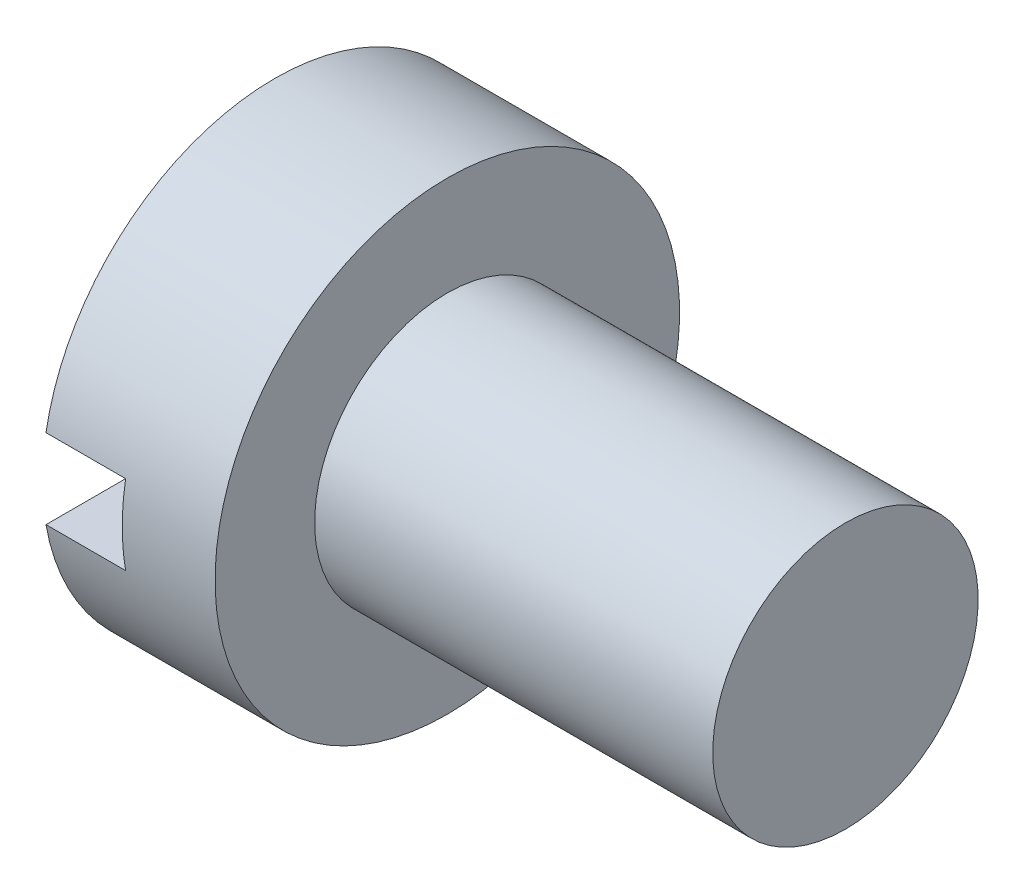
ISO-10303-21;
HEADER;
FILE_DESCRIPTION(('STEP AP214'),'2;1');
FILE_NAME('part.step','',(''),(''),'','','');
FILE_SCHEMA(('AUTOMOTIVE_DESIGN { 1 0 10303 214 1 1 1 1 }'));
ENDSEC;
DATA;
#1=APPLICATION_CONTEXT('core data for automotive mechanical design processes');
#2=APPLICATION_PROTOCOL_DEFINITION('international standard','automotive_design',2000,#1);
#3=PRODUCT_CONTEXT('',#1,'mechanical');
#4=PRODUCT('Part','Part','',(#3));
#5=PRODUCT_RELATED_PRODUCT_CATEGORY('part','',(#4));
#6=PRODUCT_DEFINITION_FORMATION('','',#4);
#7=PRODUCT_DEFINITION_CONTEXT('part definition',#1,'design');
#8=PRODUCT_DEFINITION('design','',#6,#7);
#9=PRODUCT_DEFINITION_SHAPE('','',#8);
#10=(LENGTH_UNIT() NAMED_UNIT(*) SI_UNIT(.MILLI.,.METRE.));
#11=(NAMED_UNIT(*) PLANE_ANGLE_UNIT() SI_UNIT($,.RADIAN.));
#12=(NAMED_UNIT(*) SI_UNIT($,.STERADIAN.) SOLID_ANGLE_UNIT());
#13=UNCERTAINTY_MEASURE_WITH_UNIT(LENGTH_MEASURE(1.E-05),#10,'distance_accuracy_value','');
#14=(GEOMETRIC_REPRESENTATION_CONTEXT(3) GLOBAL_UNCERTAINTY_ASSIGNED_CONTEXT((#13)) GLOBAL_UNIT_ASSIGNED_CONTEXT((#10,
#11,#12)) REPRESENTATION_CONTEXT('',''));
#15=CARTESIAN_POINT('',(0.,0.,0.));
#16=DIRECTION('',(0.,0.,1.));
#17=DIRECTION('',(1.,0.,0.));
#18=AXIS2_PLACEMENT_3D('',#15,#16,#17);
#19=CARTESIAN_POINT('',(0.,0.,0.));
#20=DIRECTION('',(-1.,0.,0.));
#21=DIRECTION('',(0.,-1.,0.));
#22=AXIS2_PLACEMENT_3D('',#19,#20,#21);
#23=PLANE('',#22);
#24=DIRECTION('',(0.,0.,-1.));
#25=VECTOR('',#24,1.);
#26=CARTESIAN_POINT('',(0.,0.599999999999996,-3.5));
#27=LINE('',#26,#25);
#28=CARTESIAN_POINT('',(0.,0.599999999999999,3.44818792991333));
#29=VERTEX_POINT('',#28);
#30=CARTESIAN_POINT('',(0.,0.599999999999996,-3.44818792991333));
#31=VERTEX_POINT('',#30);
#32=EDGE_CURVE('E82',#29,#31,#27,.T.);
#33=ORIENTED_EDGE('',*,*,#32,.F.);
#34=CARTESIAN_POINT('',(0.,0.,0.));
#35=DIRECTION('',(1.,0.,0.));
#36=DIRECTION('',(0.,1.,0.));
#37=AXIS2_PLACEMENT_3D('',#34,#35,#36);
#38=CIRCLE('',#37,3.5);
#39=EDGE_CURVE('E88',#31,#29,#38,.T.);
#40=ORIENTED_EDGE('',*,*,#39,.F.);
#41=EDGE_LOOP('',(#33,#40));
#42=FACE_BOUND('',#41,.T.);
#43=ADVANCED_FACE('F32',(#42),#23,.T.);
#44=DIRECTION('',(0.,0.,1.));
#45=VECTOR('',#44,1.);
#46=CARTESIAN_POINT('',(0.,-0.600000000000001,-3.5));
#47=LINE('',#46,#45);
#48=CARTESIAN_POINT('',(0.,-0.600000000000001,-3.44818792991333));
#49=VERTEX_POINT('',#48);
#50=CARTESIAN_POINT('',(0.,-0.599999999999999,3.44818792991333));
#51=VERTEX_POINT('',#50);
#52=EDGE_CURVE('E76',#49,#51,#47,.T.);
#53=ORIENTED_EDGE('',*,*,#52,.F.);
#54=EDGE_CURVE('E81',#51,#49,#38,.T.);
#55=ORIENTED_EDGE('',*,*,#54,.F.);
#56=EDGE_LOOP('',(#53,#55));
#57=FACE_BOUND('',#56,.T.);
#58=ADVANCED_FACE('F34',(#57),#23,.T.);
#59=CARTESIAN_POINT('',(8.6,0.,0.));
#60=DIRECTION('',(1.,0.,0.));
#61=DIRECTION('',(0.,1.,0.));
#62=AXIS2_PLACEMENT_3D('',#59,#60,#61);
#63=CYLINDRICAL_SURFACE('',#62,3.5);
#64=DIRECTION('',(1.,0.,0.));
#65=VECTOR('',#64,1.);
#66=CARTESIAN_POINT('',(8.6,0.599999999999996,-3.44818792991333));
#67=LINE('',#66,#65);
#68=CARTESIAN_POINT('',(1.2,0.599999999999996,-3.44818792991333));
#69=VERTEX_POINT('',#68);
#70=EDGE_CURVE('E11',#31,#69,#67,.T.);
#71=ORIENTED_EDGE('',*,*,#70,.F.);
#72=ORIENTED_EDGE('',*,*,#39,.T.);
#73=DIRECTION('',(1.,0.,0.));
#74=VECTOR('',#73,1.);
#75=CARTESIAN_POINT('',(8.6,0.599999999999999,3.44818792991333));
#76=LINE('',#75,#74);
#77=CARTESIAN_POINT('',(1.2,0.599999999999999,3.44818792991333));
#78=VERTEX_POINT('',#77);
#79=EDGE_CURVE('E97',#78,#29,#76,.F.);
#80=ORIENTED_EDGE('',*,*,#79,.F.);
#81=CARTESIAN_POINT('',(1.2,0.,0.));
#82=DIRECTION('',(-1.,0.,0.));
#83=DIRECTION('',(0.,0.,1.));
#84=AXIS2_PLACEMENT_3D('',#81,#82,#83);
#85=CIRCLE('',#84,3.5);
#86=CARTESIAN_POINT('',(1.2,-0.599999999999999,3.44818792991333));
#87=VERTEX_POINT('',#86);
#88=EDGE_CURVE('E47',#78,#87,#85,.F.);
#89=ORIENTED_EDGE('',*,*,#88,.T.);
#90=DIRECTION('',(1.,0.,0.));
#91=VECTOR('',#90,1.);
#92=CARTESIAN_POINT('',(8.6,-0.599999999999999,3.44818792991333));
#93=LINE('',#92,#91);
#94=EDGE_CURVE('E87',#51,#87,#93,.T.);
#95=ORIENTED_EDGE('',*,*,#94,.F.);
#96=ORIENTED_EDGE('',*,*,#54,.T.);
#97=DIRECTION('',(1.,0.,0.));
#98=VECTOR('',#97,1.);
#99=CARTESIAN_POINT('',(8.6,-0.600000000000001,-3.44818792991333));
#100=LINE('',#99,#98);
#101=CARTESIAN_POINT('',(1.2,-0.600000000000001,-3.44818792991333));
#102=VERTEX_POINT('',#101);
#103=EDGE_CURVE('E40',#102,#49,#100,.F.);
#104=ORIENTED_EDGE('',*,*,#103,.F.);
#105=EDGE_CURVE('E55',#102,#69,#85,.F.);
#106=ORIENTED_EDGE('',*,*,#105,.T.);
#107=EDGE_LOOP('',(#71,#72,#80,#89,#95,#96,#104,#106));
#108=FACE_BOUND('',#107,.T.);
#109=CARTESIAN_POINT('',(2.6,0.,0.));
#110=DIRECTION('',(1.,0.,0.));
#111=DIRECTION('',(0.,1.,0.));
#112=AXIS2_PLACEMENT_3D('',#109,#110,#111);
#113=CIRCLE('',#112,3.5);
#114=CARTESIAN_POINT('',(2.6,3.5,0.));
#115=VERTEX_POINT('',#114);
#116=EDGE_CURVE('E92',#115,#115,#113,.T.);
#117=ORIENTED_EDGE('',*,*,#116,.F.);
#118=EDGE_LOOP('',(#117));
#119=FACE_BOUND('',#118,.T.);
#120=ADVANCED_FACE('F85',(#108,#119),#63,.T.);
#121=CARTESIAN_POINT('',(2.6,3.5,0.));
#122=DIRECTION('',(1.,0.,0.));
#123=DIRECTION('',(0.,1.,0.));
#124=AXIS2_PLACEMENT_3D('',#121,#122,#123);
#125=PLANE('',#124);
#126=ORIENTED_EDGE('',*,*,#116,.T.);
#127=EDGE_LOOP('',(#126));
#128=FACE_BOUND('',#127,.T.);
#129=CARTESIAN_POINT('',(2.6,0.,0.));
#130=DIRECTION('',(1.,0.,0.));
#131=DIRECTION('',(0.,1.,0.));
#132=AXIS2_PLACEMENT_3D('',#129,#130,#131);
#133=CIRCLE('',#132,2.);
#134=CARTESIAN_POINT('',(2.6,2.,0.));
#135=VERTEX_POINT('',#134);
#136=EDGE_CURVE('E110',#135,#135,#133,.T.);
#137=ORIENTED_EDGE('',*,*,#136,.F.);
#138=EDGE_LOOP('',(#137));
#139=FACE_BOUND('',#138,.T.);
#140=ADVANCED_FACE('F117',(#128,#139),#125,.T.);
#141=CARTESIAN_POINT('',(8.6,0.,0.));
#142=DIRECTION('',(1.,0.,0.));
#143=DIRECTION('',(0.,1.,0.));
#144=AXIS2_PLACEMENT_3D('',#141,#142,#143);
#145=CYLINDRICAL_SURFACE('',#144,2.);
#146=ORIENTED_EDGE('',*,*,#136,.T.);
#147=EDGE_LOOP('',(#146));
#148=FACE_BOUND('',#147,.T.);
#149=CARTESIAN_POINT('',(8.6,0.,0.));
#150=DIRECTION('',(1.,0.,0.));
#151=DIRECTION('',(0.,1.,0.));
#152=AXIS2_PLACEMENT_3D('',#149,#150,#151);
#153=CIRCLE('',#152,2.);
#154=CARTESIAN_POINT('',(8.6,2.,0.));
#155=VERTEX_POINT('',#154);
#156=EDGE_CURVE('E108',#155,#155,#153,.T.);
#157=ORIENTED_EDGE('',*,*,#156,.F.);
#158=EDGE_LOOP('',(#157));
#159=FACE_BOUND('',#158,.T.);
#160=ADVANCED_FACE('F124',(#148,#159),#145,.T.);
#161=CARTESIAN_POINT('',(8.6,2.,0.));
#162=DIRECTION('',(1.,0.,0.));
#163=DIRECTION('',(0.,1.,0.));
#164=AXIS2_PLACEMENT_3D('',#161,#162,#163);
#165=PLANE('',#164);
#166=ORIENTED_EDGE('',*,*,#156,.T.);
#167=EDGE_LOOP('',(#166));
#168=FACE_BOUND('',#167,.T.);
#169=ADVANCED_FACE('F149',(#168),#165,.T.);
#170=CARTESIAN_POINT('',(1.2,0.599999999999996,-3.5));
#171=DIRECTION('',(0.,1.,0.));
#172=DIRECTION('',(0.,0.,1.));
#173=AXIS2_PLACEMENT_3D('',#170,#171,#172);
#174=PLANE('',#173);
#175=ORIENTED_EDGE('',*,*,#79,.T.);
#176=ORIENTED_EDGE('',*,*,#32,.T.);
#177=ORIENTED_EDGE('',*,*,#70,.T.);
#178=DIRECTION('',(0.,0.,-1.));
#179=VECTOR('',#178,1.);
#180=CARTESIAN_POINT('',(1.2,0.599999999999996,-3.5));
#181=LINE('',#180,#179);
#182=EDGE_CURVE('E104',#78,#69,#181,.T.);
#183=ORIENTED_EDGE('',*,*,#182,.F.);
#184=EDGE_LOOP('',(#175,#176,#177,#183));
#185=FACE_BOUND('',#184,.T.);
#186=ADVANCED_FACE('F144',(#185),#174,.F.);
#187=CARTESIAN_POINT('',(1.2,-0.600000000000001,-3.5));
#188=DIRECTION('',(0.,-1.,0.));
#189=DIRECTION('',(0.,0.,-1.));
#190=AXIS2_PLACEMENT_3D('',#187,#188,#189);
#191=PLANE('',#190);
#192=ORIENTED_EDGE('',*,*,#103,.T.);
#193=ORIENTED_EDGE('',*,*,#52,.T.);
#194=ORIENTED_EDGE('',*,*,#94,.T.);
#195=DIRECTION('',(0.,0.,1.));
#196=VECTOR('',#195,1.);
#197=CARTESIAN_POINT('',(1.2,-0.600000000000001,-3.5));
#198=LINE('',#197,#196);
#199=EDGE_CURVE('E77',#102,#87,#198,.T.);
#200=ORIENTED_EDGE('',*,*,#199,.F.);
#201=EDGE_LOOP('',(#192,#193,#194,#200));
#202=FACE_BOUND('',#201,.T.);
#203=ADVANCED_FACE('F75',(#202),#191,.F.);
#204=CARTESIAN_POINT('',(1.2,0.,0.));
#205=DIRECTION('',(-1.,0.,0.));
#206=DIRECTION('',(0.,0.,1.));
#207=AXIS2_PLACEMENT_3D('',#204,#205,#206);
#208=PLANE('',#207);
#209=ORIENTED_EDGE('',*,*,#199,.T.);
#210=ORIENTED_EDGE('',*,*,#88,.F.);
#211=ORIENTED_EDGE('',*,*,#182,.T.);
#212=ORIENTED_EDGE('',*,*,#105,.F.);
#213=EDGE_LOOP('',(#209,#210,#211,#212));
#214=FACE_BOUND('',#213,.T.);
#215=ADVANCED_FACE('F159',(#214),#208,.T.);
#216=CLOSED_SHELL('',(#43,#58,#120,#140,#160,#169,#186,#203,#215));
#217=MANIFOLD_SOLID_BREP('B2',#216);
#218=ADVANCED_BREP_SHAPE_REPRESENTATION('',(#18,#217),#14);
#219=SHAPE_DEFINITION_REPRESENTATION(#9,#218);
ENDSEC;
END-ISO-10303-21;
